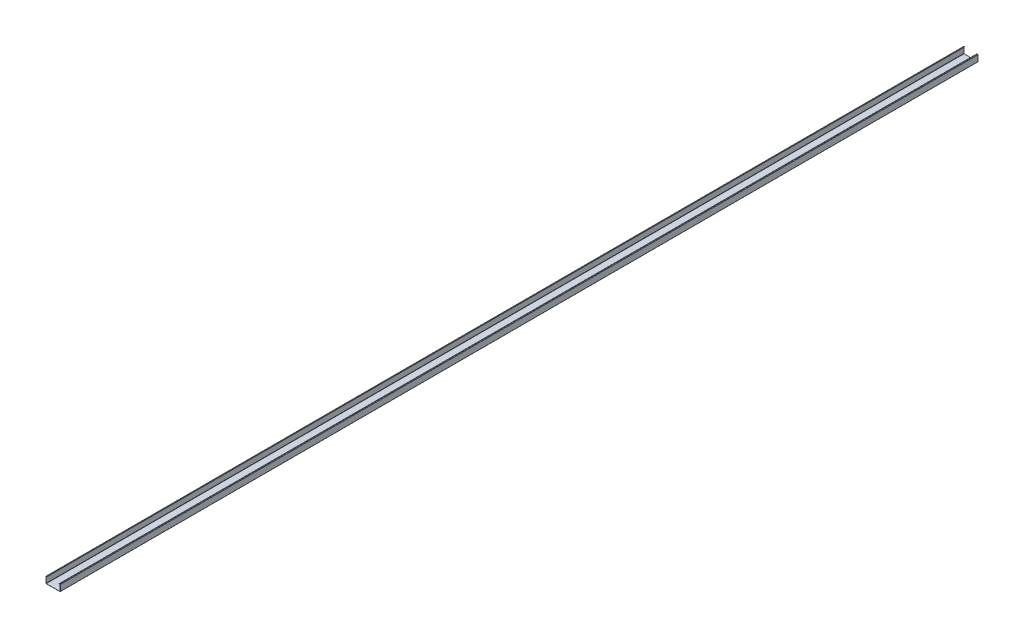
ISO-10303-21;
HEADER;
FILE_DESCRIPTION(('STEP AP214'),'2;1');
FILE_NAME('part.step','',(''),(''),'','','');
FILE_SCHEMA(('AUTOMOTIVE_DESIGN { 1 0 10303 214 1 1 1 1 }'));
ENDSEC;
DATA;
#1=APPLICATION_CONTEXT('core data for automotive mechanical design processes');
#2=APPLICATION_PROTOCOL_DEFINITION('international standard','automotive_design',2000,#1);
#3=PRODUCT_CONTEXT('',#1,'mechanical');
#4=PRODUCT('Part','Part','',(#3));
#5=PRODUCT_RELATED_PRODUCT_CATEGORY('part','',(#4));
#6=PRODUCT_DEFINITION_FORMATION('','',#4);
#7=PRODUCT_DEFINITION_CONTEXT('part definition',#1,'design');
#8=PRODUCT_DEFINITION('design','',#6,#7);
#9=PRODUCT_DEFINITION_SHAPE('','',#8);
#10=(LENGTH_UNIT() NAMED_UNIT(*) SI_UNIT(.MILLI.,.METRE.));
#11=(NAMED_UNIT(*) PLANE_ANGLE_UNIT() SI_UNIT($,.RADIAN.));
#12=(NAMED_UNIT(*) SI_UNIT($,.STERADIAN.) SOLID_ANGLE_UNIT());
#13=UNCERTAINTY_MEASURE_WITH_UNIT(LENGTH_MEASURE(1.E-05),#10,'distance_accuracy_value','');
#14=(GEOMETRIC_REPRESENTATION_CONTEXT(3) GLOBAL_UNCERTAINTY_ASSIGNED_CONTEXT((#13)) GLOBAL_UNIT_ASSIGNED_CONTEXT((#10,
#11,#12)) REPRESENTATION_CONTEXT('',''));
#15=CARTESIAN_POINT('',(0.,0.,0.));
#16=DIRECTION('',(0.,0.,1.));
#17=DIRECTION('',(1.,0.,0.));
#18=AXIS2_PLACEMENT_3D('',#15,#16,#17);
#19=CARTESIAN_POINT('',(-29.25,27.,-3925.));
#20=DIRECTION('',(0.,0.,-1.));
#21=DIRECTION('',(-1.,0.,0.));
#22=AXIS2_PLACEMENT_3D('',#19,#20,#21);
#23=PLANE('',#22);
#24=DIRECTION('',(0.,1.,0.));
#25=VECTOR('',#24,1.);
#26=CARTESIAN_POINT('',(-29.25,27.,-3925.));
#27=LINE('',#26,#25);
#28=CARTESIAN_POINT('',(-29.25,27.,-3925.));
#29=VERTEX_POINT('',#28);
#30=CARTESIAN_POINT('',(-29.25,27.5,-3925.));
#31=VERTEX_POINT('',#30);
#32=EDGE_CURVE('E11',#29,#31,#27,.T.);
#33=ORIENTED_EDGE('',*,*,#32,.F.);
#34=CARTESIAN_POINT('',(-29.25,26.25,-3925.));
#35=DIRECTION('',(0.,0.,-1.));
#36=DIRECTION('',(-1.,0.,0.));
#37=AXIS2_PLACEMENT_3D('',#34,#35,#36);
#38=CIRCLE('',#37,0.75);
#39=CARTESIAN_POINT('',(-30.,26.25,-3925.));
#40=VERTEX_POINT('',#39);
#41=EDGE_CURVE('E369',#29,#40,#38,.F.);
#42=ORIENTED_EDGE('',*,*,#41,.T.);
#43=DIRECTION('',(1.,0.,0.));
#44=VECTOR('',#43,1.);
#45=CARTESIAN_POINT('',(-30.5,26.25,-3925.));
#46=LINE('',#45,#44);
#47=CARTESIAN_POINT('',(-30.5,26.25,-3925.));
#48=VERTEX_POINT('',#47);
#49=EDGE_CURVE('E46',#48,#40,#46,.T.);
#50=ORIENTED_EDGE('',*,*,#49,.F.);
#51=CARTESIAN_POINT('',(-29.25,26.25,-3925.));
#52=DIRECTION('',(0.,0.,1.));
#53=DIRECTION('',(1.,0.,0.));
#54=AXIS2_PLACEMENT_3D('',#51,#52,#53);
#55=CIRCLE('',#54,1.25);
#56=EDGE_CURVE('E394',#31,#48,#55,.T.);
#57=ORIENTED_EDGE('',*,*,#56,.F.);
#58=EDGE_LOOP('',(#33,#42,#50,#57));
#59=FACE_BOUND('',#58,.T.);
#60=ADVANCED_FACE('F38',(#59),#23,.T.);
#61=CARTESIAN_POINT('',(-30.5,26.25,-3925.));
#62=DIRECTION('',(0.,0.,-1.));
#63=DIRECTION('',(-1.,0.,0.));
#64=AXIS2_PLACEMENT_3D('',#61,#62,#63);
#65=PLANE('',#64);
#66=DIRECTION('',(-1.,0.,0.));
#67=VECTOR('',#66,1.);
#68=CARTESIAN_POINT('',(-30.,27.,-3925.));
#69=LINE('',#68,#67);
#70=CARTESIAN_POINT('',(-26.,27.,-3925.));
#71=VERTEX_POINT('',#70);
#72=EDGE_CURVE('E373',#71,#29,#69,.T.);
#73=ORIENTED_EDGE('',*,*,#72,.T.);
#74=ORIENTED_EDGE('',*,*,#32,.T.);
#75=DIRECTION('',(1.,0.,0.));
#76=VECTOR('',#75,1.);
#77=CARTESIAN_POINT('',(-30.,27.5,-3925.));
#78=LINE('',#77,#76);
#79=CARTESIAN_POINT('',(-26.,27.5,-3925.));
#80=VERTEX_POINT('',#79);
#81=EDGE_CURVE('E391',#80,#31,#78,.F.);
#82=ORIENTED_EDGE('',*,*,#81,.F.);
#83=DIRECTION('',(0.,-1.,0.));
#84=VECTOR('',#83,1.);
#85=CARTESIAN_POINT('',(-26.,27.5,-3925.));
#86=LINE('',#85,#84);
#87=EDGE_CURVE('E389',#80,#71,#86,.T.);
#88=ORIENTED_EDGE('',*,*,#87,.T.);
#89=EDGE_LOOP('',(#73,#74,#82,#88));
#90=FACE_BOUND('',#89,.T.);
#91=ADVANCED_FACE('F419',(#90),#65,.T.);
#92=CARTESIAN_POINT('',(-30.,26.25,0.));
#93=DIRECTION('',(0.,0.,1.));
#94=DIRECTION('',(1.,0.,0.));
#95=AXIS2_PLACEMENT_3D('',#92,#93,#94);
#96=PLANE('',#95);
#97=DIRECTION('',(-1.,0.,0.));
#98=VECTOR('',#97,1.);
#99=CARTESIAN_POINT('',(-30.,26.25,0.));
#100=LINE('',#99,#98);
#101=CARTESIAN_POINT('',(-30.,26.25,0.));
#102=VERTEX_POINT('',#101);
#103=CARTESIAN_POINT('',(-30.5,26.25,0.));
#104=VERTEX_POINT('',#103);
#105=EDGE_CURVE('E353',#102,#104,#100,.T.);
#106=ORIENTED_EDGE('',*,*,#105,.F.);
#107=CARTESIAN_POINT('',(-29.25,26.25,0.));
#108=DIRECTION('',(0.,0.,-1.));
#109=DIRECTION('',(-1.,0.,0.));
#110=AXIS2_PLACEMENT_3D('',#107,#108,#109);
#111=CIRCLE('',#110,0.75);
#112=CARTESIAN_POINT('',(-29.25,27.,0.));
#113=VERTEX_POINT('',#112);
#114=EDGE_CURVE('E257',#113,#102,#111,.F.);
#115=ORIENTED_EDGE('',*,*,#114,.F.);
#116=DIRECTION('',(0.,-1.,0.));
#117=VECTOR('',#116,1.);
#118=CARTESIAN_POINT('',(-29.25,27.5,0.));
#119=LINE('',#118,#117);
#120=CARTESIAN_POINT('',(-29.25,27.5,0.));
#121=VERTEX_POINT('',#120);
#122=EDGE_CURVE('E351',#121,#113,#119,.T.);
#123=ORIENTED_EDGE('',*,*,#122,.F.);
#124=CARTESIAN_POINT('',(-29.25,26.25,0.));
#125=DIRECTION('',(0.,0.,1.));
#126=DIRECTION('',(1.,0.,0.));
#127=AXIS2_PLACEMENT_3D('',#124,#125,#126);
#128=CIRCLE('',#127,1.25);
#129=EDGE_CURVE('E268',#121,#104,#128,.T.);
#130=ORIENTED_EDGE('',*,*,#129,.T.);
#131=EDGE_LOOP('',(#106,#115,#123,#130));
#132=FACE_BOUND('',#131,.T.);
#133=ADVANCED_FACE('F427',(#132),#96,.T.);
#134=CARTESIAN_POINT('',(-29.25,27.5,0.));
#135=DIRECTION('',(0.,0.,1.));
#136=DIRECTION('',(1.,0.,0.));
#137=AXIS2_PLACEMENT_3D('',#134,#135,#136);
#138=PLANE('',#137);
#139=DIRECTION('',(0.,-1.,0.));
#140=VECTOR('',#139,1.);
#141=CARTESIAN_POINT('',(-30.,-1.39761000804391E-13,0.));
#142=LINE('',#141,#140);
#143=CARTESIAN_POINT('',(-30.,0.749999999999862,0.));
#144=VERTEX_POINT('',#143);
#145=EDGE_CURVE('E254',#102,#144,#142,.T.);
#146=ORIENTED_EDGE('',*,*,#145,.F.);
#147=ORIENTED_EDGE('',*,*,#105,.T.);
#148=DIRECTION('',(0.,1.,0.));
#149=VECTOR('',#148,1.);
#150=CARTESIAN_POINT('',(-30.5,-1.39761000804391E-13,0.));
#151=LINE('',#150,#149);
#152=CARTESIAN_POINT('',(-30.5,0.749999999999862,0.));
#153=VERTEX_POINT('',#152);
#154=EDGE_CURVE('E271',#104,#153,#151,.F.);
#155=ORIENTED_EDGE('',*,*,#154,.T.);
#156=DIRECTION('',(1.,0.,0.));
#157=VECTOR('',#156,1.);
#158=CARTESIAN_POINT('',(-30.5,0.749999999999862,0.));
#159=LINE('',#158,#157);
#160=EDGE_CURVE('E343',#153,#144,#159,.T.);
#161=ORIENTED_EDGE('',*,*,#160,.T.);
#162=EDGE_LOOP('',(#146,#147,#155,#161));
#163=FACE_BOUND('',#162,.T.);
#164=ADVANCED_FACE('F429',(#163),#138,.T.);
#165=CARTESIAN_POINT('',(-30.,0.749999999999862,-3925.));
#166=DIRECTION('',(0.,0.,-1.));
#167=DIRECTION('',(-1.,0.,0.));
#168=AXIS2_PLACEMENT_3D('',#165,#166,#167);
#169=PLANE('',#168);
#170=DIRECTION('',(-1.,0.,0.));
#171=VECTOR('',#170,1.);
#172=CARTESIAN_POINT('',(-30.,0.749999999999862,-3925.));
#173=LINE('',#172,#171);
#174=CARTESIAN_POINT('',(-30.,0.749999999999862,-3925.));
#175=VERTEX_POINT('',#174);
#176=CARTESIAN_POINT('',(-30.5,0.749999999999862,-3925.));
#177=VERTEX_POINT('',#176);
#178=EDGE_CURVE('E349',#175,#177,#173,.T.);
#179=ORIENTED_EDGE('',*,*,#178,.F.);
#180=CARTESIAN_POINT('',(-29.25,0.749999999999862,-3925.));
#181=DIRECTION('',(0.,0.,-1.));
#182=DIRECTION('',(-1.,0.,0.));
#183=AXIS2_PLACEMENT_3D('',#180,#181,#182);
#184=CIRCLE('',#183,0.75);
#185=CARTESIAN_POINT('',(-29.25,-1.38013988294336E-13,-3925.));
#186=VERTEX_POINT('',#185);
#187=EDGE_CURVE('E381',#175,#186,#184,.F.);
#188=ORIENTED_EDGE('',*,*,#187,.T.);
#189=DIRECTION('',(0.,1.,0.));
#190=VECTOR('',#189,1.);
#191=CARTESIAN_POINT('',(-29.25,-0.500000000000138,-3925.));
#192=LINE('',#191,#190);
#193=CARTESIAN_POINT('',(-29.25,-0.500000000000138,-3925.));
#194=VERTEX_POINT('',#193);
#195=EDGE_CURVE('E347',#194,#186,#192,.T.);
#196=ORIENTED_EDGE('',*,*,#195,.F.);
#197=CARTESIAN_POINT('',(-29.25,0.749999999999862,-3925.));
#198=DIRECTION('',(0.,0.,1.));
#199=DIRECTION('',(1.,0.,0.));
#200=AXIS2_PLACEMENT_3D('',#197,#198,#199);
#201=CIRCLE('',#200,1.25);
#202=EDGE_CURVE('E225',#177,#194,#201,.T.);
#203=ORIENTED_EDGE('',*,*,#202,.F.);
#204=EDGE_LOOP('',(#179,#188,#196,#203));
#205=FACE_BOUND('',#204,.T.);
#206=ADVANCED_FACE('F405',(#205),#169,.T.);
#207=CARTESIAN_POINT('',(-29.25,-0.500000000000138,-3925.));
#208=DIRECTION('',(0.,0.,-1.));
#209=DIRECTION('',(-1.,0.,0.));
#210=AXIS2_PLACEMENT_3D('',#207,#208,#209);
#211=PLANE('',#210);
#212=DIRECTION('',(0.,-1.,0.));
#213=VECTOR('',#212,1.);
#214=CARTESIAN_POINT('',(-30.,-1.39761000804391E-13,-3925.));
#215=LINE('',#214,#213);
#216=EDGE_CURVE('E360',#40,#175,#215,.T.);
#217=ORIENTED_EDGE('',*,*,#216,.T.);
#218=ORIENTED_EDGE('',*,*,#178,.T.);
#219=DIRECTION('',(0.,1.,0.));
#220=VECTOR('',#219,1.);
#221=CARTESIAN_POINT('',(-30.5,-1.39761000804391E-13,-3925.));
#222=LINE('',#221,#220);
#223=EDGE_CURVE('E363',#48,#177,#222,.F.);
#224=ORIENTED_EDGE('',*,*,#223,.F.);
#225=ORIENTED_EDGE('',*,*,#49,.T.);
#226=EDGE_LOOP('',(#217,#218,#224,#225));
#227=FACE_BOUND('',#226,.T.);
#228=ADVANCED_FACE('F358',(#227),#211,.T.);
#229=CARTESIAN_POINT('',(-29.25,-1.38013988294336E-13,0.));
#230=DIRECTION('',(0.,0.,1.));
#231=DIRECTION('',(1.,0.,0.));
#232=AXIS2_PLACEMENT_3D('',#229,#230,#231);
#233=PLANE('',#232);
#234=DIRECTION('',(0.,-1.,0.));
#235=VECTOR('',#234,1.);
#236=CARTESIAN_POINT('',(-29.25,-1.38013988294336E-13,0.));
#237=LINE('',#236,#235);
#238=CARTESIAN_POINT('',(-29.25,-1.38013988294336E-13,0.));
#239=VERTEX_POINT('',#238);
#240=CARTESIAN_POINT('',(-29.25,-0.500000000000138,0.));
#241=VERTEX_POINT('',#240);
#242=EDGE_CURVE('E345',#239,#241,#237,.T.);
#243=ORIENTED_EDGE('',*,*,#242,.F.);
#244=CARTESIAN_POINT('',(-29.25,0.749999999999862,0.));
#245=DIRECTION('',(0.,0.,-1.));
#246=DIRECTION('',(-1.,0.,0.));
#247=AXIS2_PLACEMENT_3D('',#244,#245,#246);
#248=CIRCLE('',#247,0.75);
#249=EDGE_CURVE('E251',#144,#239,#248,.F.);
#250=ORIENTED_EDGE('',*,*,#249,.F.);
#251=ORIENTED_EDGE('',*,*,#160,.F.);
#252=CARTESIAN_POINT('',(-29.25,0.749999999999862,0.));
#253=DIRECTION('',(0.,0.,1.));
#254=DIRECTION('',(1.,0.,0.));
#255=AXIS2_PLACEMENT_3D('',#252,#253,#254);
#256=CIRCLE('',#255,1.25);
#257=EDGE_CURVE('E274',#153,#241,#256,.T.);
#258=ORIENTED_EDGE('',*,*,#257,.T.);
#259=EDGE_LOOP('',(#243,#250,#251,#258));
#260=FACE_BOUND('',#259,.T.);
#261=ADVANCED_FACE('F435',(#260),#233,.T.);
#262=CARTESIAN_POINT('',(-30.5,0.749999999999862,0.));
#263=DIRECTION('',(0.,0.,1.));
#264=DIRECTION('',(1.,0.,0.));
#265=AXIS2_PLACEMENT_3D('',#262,#263,#264);
#266=PLANE('',#265);
#267=DIRECTION('',(1.,0.,0.));
#268=VECTOR('',#267,1.);
#269=CARTESIAN_POINT('',(-30.,-1.39761000804391E-13,0.));
#270=LINE('',#269,#268);
#271=CARTESIAN_POINT('',(29.25,0.,0.));
#272=VERTEX_POINT('',#271);
#273=EDGE_CURVE('E248',#239,#272,#270,.T.);
#274=ORIENTED_EDGE('',*,*,#273,.F.);
#275=ORIENTED_EDGE('',*,*,#242,.T.);
#276=DIRECTION('',(1.,0.,0.));
#277=VECTOR('',#276,1.);
#278=CARTESIAN_POINT('',(-30.,-0.50000000000014,0.));
#279=LINE('',#278,#277);
#280=CARTESIAN_POINT('',(29.25,-0.500000000000002,0.));
#281=VERTEX_POINT('',#280);
#282=EDGE_CURVE('E277',#241,#281,#279,.T.);
#283=ORIENTED_EDGE('',*,*,#282,.T.);
#284=DIRECTION('',(0.,1.,0.));
#285=VECTOR('',#284,1.);
#286=CARTESIAN_POINT('',(29.25,-0.500000000000002,0.));
#287=LINE('',#286,#285);
#288=EDGE_CURVE('E339',#281,#272,#287,.T.);
#289=ORIENTED_EDGE('',*,*,#288,.T.);
#290=EDGE_LOOP('',(#274,#275,#283,#289));
#291=FACE_BOUND('',#290,.T.);
#292=ADVANCED_FACE('F438',(#291),#266,.T.);
#293=CARTESIAN_POINT('',(29.25,0.,-3925.));
#294=DIRECTION('',(0.,0.,-1.));
#295=DIRECTION('',(-1.,0.,0.));
#296=AXIS2_PLACEMENT_3D('',#293,#294,#295);
#297=PLANE('',#296);
#298=DIRECTION('',(0.,-1.,0.));
#299=VECTOR('',#298,1.);
#300=CARTESIAN_POINT('',(29.25,0.,-3925.));
#301=LINE('',#300,#299);
#302=CARTESIAN_POINT('',(29.25,0.,-3925.));
#303=VERTEX_POINT('',#302);
#304=CARTESIAN_POINT('',(29.25,-0.500000000000002,-3925.));
#305=VERTEX_POINT('',#304);
#306=EDGE_CURVE('E197',#303,#305,#301,.T.);
#307=ORIENTED_EDGE('',*,*,#306,.F.);
#308=CARTESIAN_POINT('',(29.25,0.749999999999998,-3925.));
#309=DIRECTION('',(0.,0.,-1.));
#310=DIRECTION('',(-1.,0.,0.));
#311=AXIS2_PLACEMENT_3D('',#308,#309,#310);
#312=CIRCLE('',#311,0.75);
#313=CARTESIAN_POINT('',(30.,0.749999999999998,-3925.));
#314=VERTEX_POINT('',#313);
#315=EDGE_CURVE('E192',#303,#314,#312,.F.);
#316=ORIENTED_EDGE('',*,*,#315,.T.);
#317=DIRECTION('',(-1.,0.,0.));
#318=VECTOR('',#317,1.);
#319=CARTESIAN_POINT('',(30.5,0.749999999999998,-3925.));
#320=LINE('',#319,#318);
#321=CARTESIAN_POINT('',(30.5,0.749999999999998,-3925.));
#322=VERTEX_POINT('',#321);
#323=EDGE_CURVE('E185',#322,#314,#320,.T.);
#324=ORIENTED_EDGE('',*,*,#323,.F.);
#325=CARTESIAN_POINT('',(29.25,0.749999999999998,-3925.));
#326=DIRECTION('',(0.,0.,1.));
#327=DIRECTION('',(1.,0.,0.));
#328=AXIS2_PLACEMENT_3D('',#325,#326,#327);
#329=CIRCLE('',#328,1.25);
#330=EDGE_CURVE('E189',#305,#322,#329,.T.);
#331=ORIENTED_EDGE('',*,*,#330,.F.);
#332=EDGE_LOOP('',(#307,#316,#324,#331));
#333=FACE_BOUND('',#332,.T.);
#334=ADVANCED_FACE('F187',(#333),#297,.T.);
#335=CARTESIAN_POINT('',(30.5,0.749999999999998,-3925.));
#336=DIRECTION('',(0.,0.,-1.));
#337=DIRECTION('',(-1.,0.,0.));
#338=AXIS2_PLACEMENT_3D('',#335,#336,#337);
#339=PLANE('',#338);
#340=DIRECTION('',(1.,0.,0.));
#341=VECTOR('',#340,1.);
#342=CARTESIAN_POINT('',(-30.,-1.39761000804391E-13,-3925.));
#343=LINE('',#342,#341);
#344=EDGE_CURVE('E384',#186,#303,#343,.T.);
#345=ORIENTED_EDGE('',*,*,#344,.T.);
#346=ORIENTED_EDGE('',*,*,#306,.T.);
#347=DIRECTION('',(1.,0.,0.));
#348=VECTOR('',#347,1.);
#349=CARTESIAN_POINT('',(-30.,-0.50000000000014,-3925.));
#350=LINE('',#349,#348);
#351=EDGE_CURVE('E223',#194,#305,#350,.T.);
#352=ORIENTED_EDGE('',*,*,#351,.F.);
#353=ORIENTED_EDGE('',*,*,#195,.T.);
#354=EDGE_LOOP('',(#345,#346,#352,#353));
#355=FACE_BOUND('',#354,.T.);
#356=ADVANCED_FACE('F486',(#355),#339,.T.);
#357=CARTESIAN_POINT('',(30.,0.749999999999998,0.));
#358=DIRECTION('',(0.,0.,1.));
#359=DIRECTION('',(1.,0.,0.));
#360=AXIS2_PLACEMENT_3D('',#357,#358,#359);
#361=PLANE('',#360);
#362=DIRECTION('',(1.,0.,0.));
#363=VECTOR('',#362,1.);
#364=CARTESIAN_POINT('',(30.,0.749999999999998,0.));
#365=LINE('',#364,#363);
#366=CARTESIAN_POINT('',(30.,0.749999999999998,0.));
#367=VERTEX_POINT('',#366);
#368=CARTESIAN_POINT('',(30.5,0.749999999999998,0.));
#369=VERTEX_POINT('',#368);
#370=EDGE_CURVE('E198',#367,#369,#365,.T.);
#371=ORIENTED_EDGE('',*,*,#370,.F.);
#372=CARTESIAN_POINT('',(29.25,0.749999999999998,0.));
#373=DIRECTION('',(0.,0.,-1.));
#374=DIRECTION('',(-1.,0.,0.));
#375=AXIS2_PLACEMENT_3D('',#372,#373,#374);
#376=CIRCLE('',#375,0.75);
#377=EDGE_CURVE('E245',#272,#367,#376,.F.);
#378=ORIENTED_EDGE('',*,*,#377,.F.);
#379=ORIENTED_EDGE('',*,*,#288,.F.);
#380=CARTESIAN_POINT('',(29.25,0.749999999999998,0.));
#381=DIRECTION('',(0.,0.,1.));
#382=DIRECTION('',(1.,0.,0.));
#383=AXIS2_PLACEMENT_3D('',#380,#381,#382);
#384=CIRCLE('',#383,1.25);
#385=EDGE_CURVE('E280',#281,#369,#384,.T.);
#386=ORIENTED_EDGE('',*,*,#385,.T.);
#387=EDGE_LOOP('',(#371,#378,#379,#386));
#388=FACE_BOUND('',#387,.T.);
#389=ADVANCED_FACE('F447',(#388),#361,.T.);
#390=CARTESIAN_POINT('',(29.25,-0.500000000000002,0.));
#391=DIRECTION('',(0.,0.,1.));
#392=DIRECTION('',(1.,0.,0.));
#393=AXIS2_PLACEMENT_3D('',#390,#391,#392);
#394=PLANE('',#393);
#395=DIRECTION('',(0.,1.,0.));
#396=VECTOR('',#395,1.);
#397=CARTESIAN_POINT('',(30.,0.,0.));
#398=LINE('',#397,#396);
#399=CARTESIAN_POINT('',(30.,26.25,0.));
#400=VERTEX_POINT('',#399);
#401=EDGE_CURVE('E242',#367,#400,#398,.T.);
#402=ORIENTED_EDGE('',*,*,#401,.F.);
#403=ORIENTED_EDGE('',*,*,#370,.T.);
#404=DIRECTION('',(0.,1.,0.));
#405=VECTOR('',#404,1.);
#406=CARTESIAN_POINT('',(30.5,0.,0.));
#407=LINE('',#406,#405);
#408=CARTESIAN_POINT('',(30.5,26.25,0.));
#409=VERTEX_POINT('',#408);
#410=EDGE_CURVE('E208',#369,#409,#407,.T.);
#411=ORIENTED_EDGE('',*,*,#410,.T.);
#412=DIRECTION('',(-1.,0.,0.));
#413=VECTOR('',#412,1.);
#414=CARTESIAN_POINT('',(30.5,26.25,0.));
#415=LINE('',#414,#413);
#416=EDGE_CURVE('E119',#409,#400,#415,.T.);
#417=ORIENTED_EDGE('',*,*,#416,.T.);
#418=EDGE_LOOP('',(#402,#403,#411,#417));
#419=FACE_BOUND('',#418,.T.);
#420=ADVANCED_FACE('F450',(#419),#394,.T.);
#421=CARTESIAN_POINT('',(30.,26.25,-3925.));
#422=DIRECTION('',(0.,0.,-1.));
#423=DIRECTION('',(-1.,0.,0.));
#424=AXIS2_PLACEMENT_3D('',#421,#422,#423);
#425=PLANE('',#424);
#426=DIRECTION('',(1.,0.,0.));
#427=VECTOR('',#426,1.);
#428=CARTESIAN_POINT('',(30.,26.25,-3925.));
#429=LINE('',#428,#427);
#430=CARTESIAN_POINT('',(30.,26.25,-3925.));
#431=VERTEX_POINT('',#430);
#432=CARTESIAN_POINT('',(30.5,26.25,-3925.));
#433=VERTEX_POINT('',#432);
#434=EDGE_CURVE('E216',#431,#433,#429,.T.);
#435=ORIENTED_EDGE('',*,*,#434,.F.);
#436=CARTESIAN_POINT('',(29.25,26.25,-3925.));
#437=DIRECTION('',(0.,0.,-1.));
#438=DIRECTION('',(-1.,0.,0.));
#439=AXIS2_PLACEMENT_3D('',#436,#437,#438);
#440=CIRCLE('',#439,0.75);
#441=CARTESIAN_POINT('',(29.25,27.,-3925.));
#442=VERTEX_POINT('',#441);
#443=EDGE_CURVE('E460',#431,#442,#440,.F.);
#444=ORIENTED_EDGE('',*,*,#443,.T.);
#445=DIRECTION('',(0.,-1.,0.));
#446=VECTOR('',#445,1.);
#447=CARTESIAN_POINT('',(29.25,27.5,-3925.));
#448=LINE('',#447,#446);
#449=CARTESIAN_POINT('',(29.25,27.5,-3925.));
#450=VERTEX_POINT('',#449);
#451=EDGE_CURVE('E54',#450,#442,#448,.T.);
#452=ORIENTED_EDGE('',*,*,#451,.F.);
#453=CARTESIAN_POINT('',(29.25,26.25,-3925.));
#454=DIRECTION('',(0.,0.,1.));
#455=DIRECTION('',(1.,0.,0.));
#456=AXIS2_PLACEMENT_3D('',#453,#454,#455);
#457=CIRCLE('',#456,1.25);
#458=EDGE_CURVE('E218',#433,#450,#457,.T.);
#459=ORIENTED_EDGE('',*,*,#458,.F.);
#460=EDGE_LOOP('',(#435,#444,#452,#459));
#461=FACE_BOUND('',#460,.T.);
#462=ADVANCED_FACE('F525',(#461),#425,.T.);
#463=CARTESIAN_POINT('',(29.25,27.5,-3925.));
#464=DIRECTION('',(0.,0.,-1.));
#465=DIRECTION('',(-1.,0.,0.));
#466=AXIS2_PLACEMENT_3D('',#463,#464,#465);
#467=PLANE('',#466);
#468=DIRECTION('',(0.,1.,0.));
#469=VECTOR('',#468,1.);
#470=CARTESIAN_POINT('',(30.,0.,-3925.));
#471=LINE('',#470,#469);
#472=EDGE_CURVE('E478',#314,#431,#471,.T.);
#473=ORIENTED_EDGE('',*,*,#472,.T.);
#474=ORIENTED_EDGE('',*,*,#434,.T.);
#475=DIRECTION('',(0.,1.,0.));
#476=VECTOR('',#475,1.);
#477=CARTESIAN_POINT('',(30.5,0.,-3925.));
#478=LINE('',#477,#476);
#479=EDGE_CURVE('E206',#322,#433,#478,.T.);
#480=ORIENTED_EDGE('',*,*,#479,.F.);
#481=ORIENTED_EDGE('',*,*,#323,.T.);
#482=EDGE_LOOP('',(#473,#474,#480,#481));
#483=FACE_BOUND('',#482,.T.);
#484=ADVANCED_FACE('F215',(#483),#467,.T.);
#485=CARTESIAN_POINT('',(29.25,27.,0.));
#486=DIRECTION('',(0.,0.,1.));
#487=DIRECTION('',(1.,0.,0.));
#488=AXIS2_PLACEMENT_3D('',#485,#486,#487);
#489=PLANE('',#488);
#490=DIRECTION('',(0.,1.,0.));
#491=VECTOR('',#490,1.);
#492=CARTESIAN_POINT('',(29.25,27.,0.));
#493=LINE('',#492,#491);
#494=CARTESIAN_POINT('',(29.25,27.,0.));
#495=VERTEX_POINT('',#494);
#496=CARTESIAN_POINT('',(29.25,27.5,0.));
#497=VERTEX_POINT('',#496);
#498=EDGE_CURVE('E126',#495,#497,#493,.T.);
#499=ORIENTED_EDGE('',*,*,#498,.F.);
#500=CARTESIAN_POINT('',(29.25,26.25,0.));
#501=DIRECTION('',(0.,0.,-1.));
#502=DIRECTION('',(-1.,0.,0.));
#503=AXIS2_PLACEMENT_3D('',#500,#501,#502);
#504=CIRCLE('',#503,0.75);
#505=EDGE_CURVE('E239',#400,#495,#504,.F.);
#506=ORIENTED_EDGE('',*,*,#505,.F.);
#507=ORIENTED_EDGE('',*,*,#416,.F.);
#508=CARTESIAN_POINT('',(29.25,26.25,0.));
#509=DIRECTION('',(0.,0.,1.));
#510=DIRECTION('',(1.,0.,0.));
#511=AXIS2_PLACEMENT_3D('',#508,#509,#510);
#512=CIRCLE('',#511,1.25);
#513=EDGE_CURVE('E283',#409,#497,#512,.T.);
#514=ORIENTED_EDGE('',*,*,#513,.T.);
#515=EDGE_LOOP('',(#499,#506,#507,#514));
#516=FACE_BOUND('',#515,.T.);
#517=ADVANCED_FACE('F461',(#516),#489,.T.);
#518=CARTESIAN_POINT('',(30.5,26.25,0.));
#519=DIRECTION('',(0.,0.,1.));
#520=DIRECTION('',(1.,0.,0.));
#521=AXIS2_PLACEMENT_3D('',#518,#519,#520);
#522=PLANE('',#521);
#523=DIRECTION('',(-1.,0.,0.));
#524=VECTOR('',#523,1.);
#525=CARTESIAN_POINT('',(30.,27.,0.));
#526=LINE('',#525,#524);
#527=CARTESIAN_POINT('',(26.,27.,0.));
#528=VERTEX_POINT('',#527);
#529=EDGE_CURVE('E237',#495,#528,#526,.T.);
#530=ORIENTED_EDGE('',*,*,#529,.F.);
#531=ORIENTED_EDGE('',*,*,#498,.T.);
#532=DIRECTION('',(1.,0.,0.));
#533=VECTOR('',#532,1.);
#534=CARTESIAN_POINT('',(30.,27.5,0.));
#535=LINE('',#534,#533);
#536=CARTESIAN_POINT('',(26.,27.5,0.));
#537=VERTEX_POINT('',#536);
#538=EDGE_CURVE('E232',#497,#537,#535,.F.);
#539=ORIENTED_EDGE('',*,*,#538,.T.);
#540=DIRECTION('',(0.,1.,0.));
#541=VECTOR('',#540,1.);
#542=CARTESIAN_POINT('',(26.,27.,0.));
#543=LINE('',#542,#541);
#544=EDGE_CURVE('E234',#528,#537,#543,.T.);
#545=ORIENTED_EDGE('',*,*,#544,.F.);
#546=EDGE_LOOP('',(#530,#531,#539,#545));
#547=FACE_BOUND('',#546,.T.);
#548=ADVANCED_FACE('F469',(#547),#522,.T.);
#549=CARTESIAN_POINT('',(30.,27.5,-3925.));
#550=DIRECTION('',(0.,1.,0.));
#551=DIRECTION('',(0.,0.,1.));
#552=AXIS2_PLACEMENT_3D('',#549,#550,#551);
#553=PLANE('',#552);
#554=ORIENTED_EDGE('',*,*,#538,.F.);
#555=DIRECTION('',(0.,0.,1.));
#556=VECTOR('',#555,1.);
#557=CARTESIAN_POINT('',(29.25,27.5,-3925.));
#558=LINE('',#557,#556);
#559=EDGE_CURVE('E286',#450,#497,#558,.T.);
#560=ORIENTED_EDGE('',*,*,#559,.F.);
#561=DIRECTION('',(1.,0.,0.));
#562=VECTOR('',#561,1.);
#563=CARTESIAN_POINT('',(30.,27.5,-3925.));
#564=LINE('',#563,#562);
#565=CARTESIAN_POINT('',(26.,27.5,-3925.));
#566=VERTEX_POINT('',#565);
#567=EDGE_CURVE('E285',#450,#566,#564,.F.);
#568=ORIENTED_EDGE('',*,*,#567,.T.);
#569=DIRECTION('',(0.,0.,1.));
#570=VECTOR('',#569,1.);
#571=CARTESIAN_POINT('',(26.,27.5,-3925.));
#572=LINE('',#571,#570);
#573=EDGE_CURVE('E231',#566,#537,#572,.T.);
#574=ORIENTED_EDGE('',*,*,#573,.T.);
#575=EDGE_LOOP('',(#554,#560,#568,#574));
#576=FACE_BOUND('',#575,.T.);
#577=ADVANCED_FACE('F467',(#576),#553,.T.);
#578=CARTESIAN_POINT('',(29.25,26.25,-3925.));
#579=DIRECTION('',(0.,0.,1.));
#580=DIRECTION('',(1.,0.,0.));
#581=AXIS2_PLACEMENT_3D('',#578,#579,#580);
#582=CYLINDRICAL_SURFACE('',#581,1.25);
#583=ORIENTED_EDGE('',*,*,#513,.F.);
#584=DIRECTION('',(0.,0.,1.));
#585=VECTOR('',#584,1.);
#586=CARTESIAN_POINT('',(30.5,26.25,-3925.));
#587=LINE('',#586,#585);
#588=EDGE_CURVE('E212',#433,#409,#587,.T.);
#589=ORIENTED_EDGE('',*,*,#588,.F.);
#590=ORIENTED_EDGE('',*,*,#458,.T.);
#591=ORIENTED_EDGE('',*,*,#559,.T.);
#592=EDGE_LOOP('',(#583,#589,#590,#591));
#593=FACE_BOUND('',#592,.T.);
#594=ADVANCED_FACE('F463',(#593),#582,.T.);
#595=CARTESIAN_POINT('',(30.5,0.,-3925.));
#596=DIRECTION('',(1.,0.,0.));
#597=DIRECTION('',(0.,0.,-1.));
#598=AXIS2_PLACEMENT_3D('',#595,#596,#597);
#599=PLANE('',#598);
#600=ORIENTED_EDGE('',*,*,#410,.F.);
#601=DIRECTION('',(0.,0.,1.));
#602=VECTOR('',#601,1.);
#603=CARTESIAN_POINT('',(30.5,0.749999999999998,-3925.));
#604=LINE('',#603,#602);
#605=EDGE_CURVE('E204',#322,#369,#604,.T.);
#606=ORIENTED_EDGE('',*,*,#605,.F.);
#607=ORIENTED_EDGE('',*,*,#479,.T.);
#608=ORIENTED_EDGE('',*,*,#588,.T.);
#609=EDGE_LOOP('',(#600,#606,#607,#608));
#610=FACE_BOUND('',#609,.T.);
#611=ADVANCED_FACE('F205',(#610),#599,.T.);
#612=CARTESIAN_POINT('',(29.25,0.749999999999998,-3925.));
#613=DIRECTION('',(0.,0.,1.));
#614=DIRECTION('',(1.,0.,0.));
#615=AXIS2_PLACEMENT_3D('',#612,#613,#614);
#616=CYLINDRICAL_SURFACE('',#615,1.25);
#617=ORIENTED_EDGE('',*,*,#385,.F.);
#618=DIRECTION('',(0.,0.,1.));
#619=VECTOR('',#618,1.);
#620=CARTESIAN_POINT('',(29.25,-0.500000000000002,-3925.));
#621=LINE('',#620,#619);
#622=EDGE_CURVE('E213',#305,#281,#621,.T.);
#623=ORIENTED_EDGE('',*,*,#622,.F.);
#624=ORIENTED_EDGE('',*,*,#330,.T.);
#625=ORIENTED_EDGE('',*,*,#605,.T.);
#626=EDGE_LOOP('',(#617,#623,#624,#625));
#627=FACE_BOUND('',#626,.T.);
#628=ADVANCED_FACE('F221',(#627),#616,.T.);
#629=CARTESIAN_POINT('',(-30.,-0.50000000000014,-3925.));
#630=DIRECTION('',(0.,-1.,0.));
#631=DIRECTION('',(1.,0.,0.));
#632=AXIS2_PLACEMENT_3D('',#629,#630,#631);
#633=PLANE('',#632);
#634=ORIENTED_EDGE('',*,*,#282,.F.);
#635=DIRECTION('',(0.,0.,1.));
#636=VECTOR('',#635,1.);
#637=CARTESIAN_POINT('',(-29.25,-0.500000000000138,-3925.));
#638=LINE('',#637,#636);
#639=EDGE_CURVE('E290',#194,#241,#638,.T.);
#640=ORIENTED_EDGE('',*,*,#639,.F.);
#641=ORIENTED_EDGE('',*,*,#351,.T.);
#642=ORIENTED_EDGE('',*,*,#622,.T.);
#643=EDGE_LOOP('',(#634,#640,#641,#642));
#644=FACE_BOUND('',#643,.T.);
#645=ADVANCED_FACE('F489',(#644),#633,.T.);
#646=CARTESIAN_POINT('',(-29.25,0.749999999999862,-3925.));
#647=DIRECTION('',(0.,0.,1.));
#648=DIRECTION('',(1.,0.,0.));
#649=AXIS2_PLACEMENT_3D('',#646,#647,#648);
#650=CYLINDRICAL_SURFACE('',#649,1.25);
#651=ORIENTED_EDGE('',*,*,#257,.F.);
#652=DIRECTION('',(0.,0.,1.));
#653=VECTOR('',#652,1.);
#654=CARTESIAN_POINT('',(-30.5,0.749999999999862,-3925.));
#655=LINE('',#654,#653);
#656=EDGE_CURVE('E293',#177,#153,#655,.T.);
#657=ORIENTED_EDGE('',*,*,#656,.F.);
#658=ORIENTED_EDGE('',*,*,#202,.T.);
#659=ORIENTED_EDGE('',*,*,#639,.T.);
#660=EDGE_LOOP('',(#651,#657,#658,#659));
#661=FACE_BOUND('',#660,.T.);
#662=ADVANCED_FACE('F401',(#661),#650,.T.);
#663=CARTESIAN_POINT('',(-30.5,-1.39761000804391E-13,-3925.));
#664=DIRECTION('',(-1.,0.,0.));
#665=DIRECTION('',(0.,0.,1.));
#666=AXIS2_PLACEMENT_3D('',#663,#664,#665);
#667=PLANE('',#666);
#668=ORIENTED_EDGE('',*,*,#154,.F.);
#669=DIRECTION('',(0.,0.,1.));
#670=VECTOR('',#669,1.);
#671=CARTESIAN_POINT('',(-30.5,26.25,-3925.));
#672=LINE('',#671,#670);
#673=EDGE_CURVE('E296',#48,#104,#672,.T.);
#674=ORIENTED_EDGE('',*,*,#673,.F.);
#675=ORIENTED_EDGE('',*,*,#223,.T.);
#676=ORIENTED_EDGE('',*,*,#656,.T.);
#677=EDGE_LOOP('',(#668,#674,#675,#676));
#678=FACE_BOUND('',#677,.T.);
#679=ADVANCED_FACE('F408',(#678),#667,.T.);
#680=CARTESIAN_POINT('',(-29.25,26.25,-3925.));
#681=DIRECTION('',(0.,0.,1.));
#682=DIRECTION('',(1.,0.,0.));
#683=AXIS2_PLACEMENT_3D('',#680,#681,#682);
#684=CYLINDRICAL_SURFACE('',#683,1.25);
#685=ORIENTED_EDGE('',*,*,#129,.F.);
#686=DIRECTION('',(0.,0.,1.));
#687=VECTOR('',#686,1.);
#688=CARTESIAN_POINT('',(-29.25,27.5,-3925.));
#689=LINE('',#688,#687);
#690=EDGE_CURVE('E299',#31,#121,#689,.T.);
#691=ORIENTED_EDGE('',*,*,#690,.F.);
#692=ORIENTED_EDGE('',*,*,#56,.T.);
#693=ORIENTED_EDGE('',*,*,#673,.T.);
#694=EDGE_LOOP('',(#685,#691,#692,#693));
#695=FACE_BOUND('',#694,.T.);
#696=ADVANCED_FACE('F411',(#695),#684,.T.);
#697=CARTESIAN_POINT('',(-30.,27.5,-3925.));
#698=DIRECTION('',(0.,1.,0.));
#699=DIRECTION('',(0.,0.,1.));
#700=AXIS2_PLACEMENT_3D('',#697,#698,#699);
#701=PLANE('',#700);
#702=DIRECTION('',(1.,0.,0.));
#703=VECTOR('',#702,1.);
#704=CARTESIAN_POINT('',(-30.,27.5,0.));
#705=LINE('',#704,#703);
#706=CARTESIAN_POINT('',(-26.,27.5,0.));
#707=VERTEX_POINT('',#706);
#708=EDGE_CURVE('E265',#707,#121,#705,.F.);
#709=ORIENTED_EDGE('',*,*,#708,.F.);
#710=DIRECTION('',(0.,0.,1.));
#711=VECTOR('',#710,1.);
#712=CARTESIAN_POINT('',(-26.,27.5,-3925.));
#713=LINE('',#712,#711);
#714=EDGE_CURVE('E302',#80,#707,#713,.T.);
#715=ORIENTED_EDGE('',*,*,#714,.F.);
#716=ORIENTED_EDGE('',*,*,#81,.T.);
#717=ORIENTED_EDGE('',*,*,#690,.T.);
#718=EDGE_LOOP('',(#709,#715,#716,#717));
#719=FACE_BOUND('',#718,.T.);
#720=ADVANCED_FACE('F416',(#719),#701,.T.);
#721=CARTESIAN_POINT('',(-26.,27.5,-3925.));
#722=DIRECTION('',(-1.,0.,0.));
#723=DIRECTION('',(0.,0.,1.));
#724=AXIS2_PLACEMENT_3D('',#721,#722,#723);
#725=PLANE('',#724);
#726=DIRECTION('',(0.,-1.,0.));
#727=VECTOR('',#726,1.);
#728=CARTESIAN_POINT('',(-26.,27.5,0.));
#729=LINE('',#728,#727);
#730=CARTESIAN_POINT('',(-26.,27.,0.));
#731=VERTEX_POINT('',#730);
#732=EDGE_CURVE('E263',#707,#731,#729,.T.);
#733=ORIENTED_EDGE('',*,*,#732,.T.);
#734=DIRECTION('',(0.,0.,1.));
#735=VECTOR('',#734,1.);
#736=CARTESIAN_POINT('',(-26.,27.,-3925.));
#737=LINE('',#736,#735);
#738=EDGE_CURVE('E304',#71,#731,#737,.T.);
#739=ORIENTED_EDGE('',*,*,#738,.F.);
#740=ORIENTED_EDGE('',*,*,#87,.F.);
#741=ORIENTED_EDGE('',*,*,#714,.T.);
#742=EDGE_LOOP('',(#733,#739,#740,#741));
#743=FACE_BOUND('',#742,.T.);
#744=ADVANCED_FACE('F557',(#743),#725,.F.);
#745=CARTESIAN_POINT('',(-30.,27.,-3925.));
#746=DIRECTION('',(0.,1.,0.));
#747=DIRECTION('',(0.,0.,1.));
#748=AXIS2_PLACEMENT_3D('',#745,#746,#747);
#749=PLANE('',#748);
#750=DIRECTION('',(-1.,0.,0.));
#751=VECTOR('',#750,1.);
#752=CARTESIAN_POINT('',(-30.,27.,0.));
#753=LINE('',#752,#751);
#754=EDGE_CURVE('E260',#731,#113,#753,.T.);
#755=ORIENTED_EDGE('',*,*,#754,.T.);
#756=DIRECTION('',(0.,0.,1.));
#757=VECTOR('',#756,1.);
#758=CARTESIAN_POINT('',(-29.25,27.,-3925.));
#759=LINE('',#758,#757);
#760=EDGE_CURVE('E307',#29,#113,#759,.T.);
#761=ORIENTED_EDGE('',*,*,#760,.F.);
#762=ORIENTED_EDGE('',*,*,#72,.F.);
#763=ORIENTED_EDGE('',*,*,#738,.T.);
#764=EDGE_LOOP('',(#755,#761,#762,#763));
#765=FACE_BOUND('',#764,.T.);
#766=ADVANCED_FACE('F424',(#765),#749,.F.);
#767=CARTESIAN_POINT('',(-29.25,26.25,-3925.));
#768=DIRECTION('',(0.,0.,1.));
#769=DIRECTION('',(1.,0.,0.));
#770=AXIS2_PLACEMENT_3D('',#767,#768,#769);
#771=CYLINDRICAL_SURFACE('',#770,0.75);
#772=ORIENTED_EDGE('',*,*,#114,.T.);
#773=DIRECTION('',(0.,0.,1.));
#774=VECTOR('',#773,1.);
#775=CARTESIAN_POINT('',(-30.,26.25,-3925.));
#776=LINE('',#775,#774);
#777=EDGE_CURVE('E310',#40,#102,#776,.T.);
#778=ORIENTED_EDGE('',*,*,#777,.F.);
#779=ORIENTED_EDGE('',*,*,#41,.F.);
#780=ORIENTED_EDGE('',*,*,#760,.T.);
#781=EDGE_LOOP('',(#772,#778,#779,#780));
#782=FACE_BOUND('',#781,.T.);
#783=ADVANCED_FACE('F375',(#782),#771,.F.);
#784=CARTESIAN_POINT('',(-30.,-1.39761000804391E-13,-3925.));
#785=DIRECTION('',(-1.,0.,0.));
#786=DIRECTION('',(0.,0.,1.));
#787=AXIS2_PLACEMENT_3D('',#784,#785,#786);
#788=PLANE('',#787);
#789=ORIENTED_EDGE('',*,*,#145,.T.);
#790=DIRECTION('',(0.,0.,1.));
#791=VECTOR('',#790,1.);
#792=CARTESIAN_POINT('',(-30.,0.749999999999862,-3925.));
#793=LINE('',#792,#791);
#794=EDGE_CURVE('E313',#175,#144,#793,.T.);
#795=ORIENTED_EDGE('',*,*,#794,.F.);
#796=ORIENTED_EDGE('',*,*,#216,.F.);
#797=ORIENTED_EDGE('',*,*,#777,.T.);
#798=EDGE_LOOP('',(#789,#795,#796,#797));
#799=FACE_BOUND('',#798,.T.);
#800=ADVANCED_FACE('F379',(#799),#788,.F.);
#801=CARTESIAN_POINT('',(-29.25,0.749999999999862,-3925.));
#802=DIRECTION('',(0.,0.,1.));
#803=DIRECTION('',(1.,0.,0.));
#804=AXIS2_PLACEMENT_3D('',#801,#802,#803);
#805=CYLINDRICAL_SURFACE('',#804,0.75);
#806=ORIENTED_EDGE('',*,*,#249,.T.);
#807=DIRECTION('',(0.,0.,1.));
#808=VECTOR('',#807,1.);
#809=CARTESIAN_POINT('',(-29.25,-1.38013988294336E-13,-3925.));
#810=LINE('',#809,#808);
#811=EDGE_CURVE('E316',#186,#239,#810,.T.);
#812=ORIENTED_EDGE('',*,*,#811,.F.);
#813=ORIENTED_EDGE('',*,*,#187,.F.);
#814=ORIENTED_EDGE('',*,*,#794,.T.);
#815=EDGE_LOOP('',(#806,#812,#813,#814));
#816=FACE_BOUND('',#815,.T.);
#817=ADVANCED_FACE('F432',(#816),#805,.F.);
#818=CARTESIAN_POINT('',(-30.,-1.39761000804391E-13,-3925.));
#819=DIRECTION('',(0.,-1.,0.));
#820=DIRECTION('',(1.,0.,0.));
#821=AXIS2_PLACEMENT_3D('',#818,#819,#820);
#822=PLANE('',#821);
#823=ORIENTED_EDGE('',*,*,#273,.T.);
#824=DIRECTION('',(0.,0.,1.));
#825=VECTOR('',#824,1.);
#826=CARTESIAN_POINT('',(29.25,0.,-3925.));
#827=LINE('',#826,#825);
#828=EDGE_CURVE('E319',#303,#272,#827,.T.);
#829=ORIENTED_EDGE('',*,*,#828,.F.);
#830=ORIENTED_EDGE('',*,*,#344,.F.);
#831=ORIENTED_EDGE('',*,*,#811,.T.);
#832=EDGE_LOOP('',(#823,#829,#830,#831));
#833=FACE_BOUND('',#832,.T.);
#834=ADVANCED_FACE('F441',(#833),#822,.F.);
#835=CARTESIAN_POINT('',(29.25,0.749999999999998,-3925.));
#836=DIRECTION('',(0.,0.,1.));
#837=DIRECTION('',(1.,0.,0.));
#838=AXIS2_PLACEMENT_3D('',#835,#836,#837);
#839=CYLINDRICAL_SURFACE('',#838,0.75);
#840=ORIENTED_EDGE('',*,*,#377,.T.);
#841=DIRECTION('',(0.,0.,1.));
#842=VECTOR('',#841,1.);
#843=CARTESIAN_POINT('',(30.,0.749999999999998,-3925.));
#844=LINE('',#843,#842);
#845=EDGE_CURVE('E322',#314,#367,#844,.T.);
#846=ORIENTED_EDGE('',*,*,#845,.F.);
#847=ORIENTED_EDGE('',*,*,#315,.F.);
#848=ORIENTED_EDGE('',*,*,#828,.T.);
#849=EDGE_LOOP('',(#840,#846,#847,#848));
#850=FACE_BOUND('',#849,.T.);
#851=ADVANCED_FACE('F445',(#850),#839,.F.);
#852=CARTESIAN_POINT('',(30.,0.,-3925.));
#853=DIRECTION('',(1.,0.,0.));
#854=DIRECTION('',(0.,0.,-1.));
#855=AXIS2_PLACEMENT_3D('',#852,#853,#854);
#856=PLANE('',#855);
#857=ORIENTED_EDGE('',*,*,#401,.T.);
#858=DIRECTION('',(0.,0.,1.));
#859=VECTOR('',#858,1.);
#860=CARTESIAN_POINT('',(30.,26.25,-3925.));
#861=LINE('',#860,#859);
#862=EDGE_CURVE('E325',#431,#400,#861,.T.);
#863=ORIENTED_EDGE('',*,*,#862,.F.);
#864=ORIENTED_EDGE('',*,*,#472,.F.);
#865=ORIENTED_EDGE('',*,*,#845,.T.);
#866=EDGE_LOOP('',(#857,#863,#864,#865));
#867=FACE_BOUND('',#866,.T.);
#868=ADVANCED_FACE('F454',(#867),#856,.F.);
#869=CARTESIAN_POINT('',(29.25,26.25,-3925.));
#870=DIRECTION('',(0.,0.,1.));
#871=DIRECTION('',(1.,0.,0.));
#872=AXIS2_PLACEMENT_3D('',#869,#870,#871);
#873=CYLINDRICAL_SURFACE('',#872,0.75);
#874=ORIENTED_EDGE('',*,*,#505,.T.);
#875=DIRECTION('',(0.,0.,1.));
#876=VECTOR('',#875,1.);
#877=CARTESIAN_POINT('',(29.25,27.,-3925.));
#878=LINE('',#877,#876);
#879=EDGE_CURVE('E328',#442,#495,#878,.T.);
#880=ORIENTED_EDGE('',*,*,#879,.F.);
#881=ORIENTED_EDGE('',*,*,#443,.F.);
#882=ORIENTED_EDGE('',*,*,#862,.T.);
#883=EDGE_LOOP('',(#874,#880,#881,#882));
#884=FACE_BOUND('',#883,.T.);
#885=ADVANCED_FACE('F458',(#884),#873,.F.);
#886=CARTESIAN_POINT('',(30.,27.,-3925.));
#887=DIRECTION('',(0.,1.,0.));
#888=DIRECTION('',(0.,0.,1.));
#889=AXIS2_PLACEMENT_3D('',#886,#887,#888);
#890=PLANE('',#889);
#891=ORIENTED_EDGE('',*,*,#529,.T.);
#892=DIRECTION('',(0.,0.,1.));
#893=VECTOR('',#892,1.);
#894=CARTESIAN_POINT('',(26.,27.,-3925.));
#895=LINE('',#894,#893);
#896=CARTESIAN_POINT('',(26.,27.,-3925.));
#897=VERTEX_POINT('',#896);
#898=EDGE_CURVE('E331',#897,#528,#895,.T.);
#899=ORIENTED_EDGE('',*,*,#898,.F.);
#900=DIRECTION('',(-1.,0.,0.));
#901=VECTOR('',#900,1.);
#902=CARTESIAN_POINT('',(30.,27.,-3925.));
#903=LINE('',#902,#901);
#904=EDGE_CURVE('E476',#442,#897,#903,.T.);
#905=ORIENTED_EDGE('',*,*,#904,.F.);
#906=ORIENTED_EDGE('',*,*,#879,.T.);
#907=EDGE_LOOP('',(#891,#899,#905,#906));
#908=FACE_BOUND('',#907,.T.);
#909=ADVANCED_FACE('F475',(#908),#890,.F.);
#910=CARTESIAN_POINT('',(26.,27.,-3925.));
#911=DIRECTION('',(1.,0.,0.));
#912=DIRECTION('',(0.,0.,-1.));
#913=AXIS2_PLACEMENT_3D('',#910,#911,#912);
#914=PLANE('',#913);
#915=ORIENTED_EDGE('',*,*,#544,.T.);
#916=ORIENTED_EDGE('',*,*,#573,.F.);
#917=DIRECTION('',(0.,1.,0.));
#918=VECTOR('',#917,1.);
#919=CARTESIAN_POINT('',(26.,27.,-3925.));
#920=LINE('',#919,#918);
#921=EDGE_CURVE('E135',#897,#566,#920,.T.);
#922=ORIENTED_EDGE('',*,*,#921,.F.);
#923=ORIENTED_EDGE('',*,*,#898,.T.);
#924=EDGE_LOOP('',(#915,#916,#922,#923));
#925=FACE_BOUND('',#924,.T.);
#926=ADVANCED_FACE('F471',(#925),#914,.F.);
#927=CARTESIAN_POINT('',(29.25,26.25,-3925.));
#928=DIRECTION('',(0.,0.,-1.));
#929=DIRECTION('',(-1.,0.,0.));
#930=AXIS2_PLACEMENT_3D('',#927,#928,#929);
#931=PLANE('',#930);
#932=ORIENTED_EDGE('',*,*,#567,.F.);
#933=ORIENTED_EDGE('',*,*,#451,.T.);
#934=ORIENTED_EDGE('',*,*,#904,.T.);
#935=ORIENTED_EDGE('',*,*,#921,.T.);
#936=EDGE_LOOP('',(#932,#933,#934,#935));
#937=FACE_BOUND('',#936,.T.);
#938=ADVANCED_FACE('F538',(#937),#931,.T.);
#939=CARTESIAN_POINT('',(29.25,26.25,0.));
#940=DIRECTION('',(0.,0.,-1.));
#941=DIRECTION('',(-1.,0.,0.));
#942=AXIS2_PLACEMENT_3D('',#939,#940,#941);
#943=PLANE('',#942);
#944=ORIENTED_EDGE('',*,*,#708,.T.);
#945=ORIENTED_EDGE('',*,*,#122,.T.);
#946=ORIENTED_EDGE('',*,*,#754,.F.);
#947=ORIENTED_EDGE('',*,*,#732,.F.);
#948=EDGE_LOOP('',(#944,#945,#946,#947));
#949=FACE_BOUND('',#948,.T.);
#950=ADVANCED_FACE('F628',(#949),#943,.F.);
#951=CLOSED_SHELL('',(#60,#91,#133,#164,#206,#228,#261,#292,#334,#356,#389,#420,#462,#484,#517,
#548,#577,#594,#611,#628,#645,#662,#679,#696,#720,#744,#766,#783,#800,#817,#834,#851,#868,#885,
#909,#926,#938,#950));
#952=MANIFOLD_SOLID_BREP('B2',#951);
#953=ADVANCED_BREP_SHAPE_REPRESENTATION('',(#18,#952),#14);
#954=SHAPE_DEFINITION_REPRESENTATION(#9,#953);
ENDSEC;
END-ISO-10303-21;
